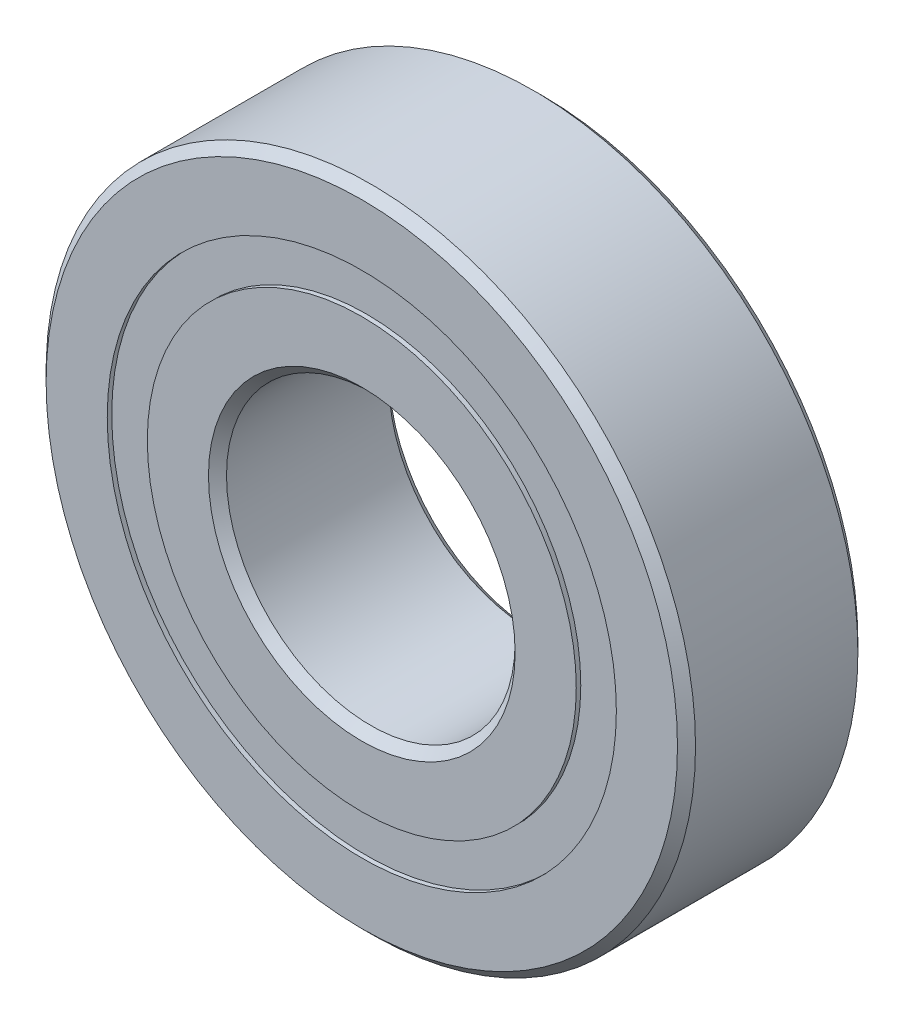
ISO-10303-21;
HEADER;
FILE_DESCRIPTION(('STEP AP214'),'2;1');
FILE_NAME('part.step','',(''),(''),'','','');
FILE_SCHEMA(('AUTOMOTIVE_DESIGN { 1 0 10303 214 1 1 1 1 }'));
ENDSEC;
DATA;
#1=APPLICATION_CONTEXT('core data for automotive mechanical design processes');
#2=APPLICATION_PROTOCOL_DEFINITION('international standard','automotive_design',2000,#1);
#3=PRODUCT_CONTEXT('',#1,'mechanical');
#4=PRODUCT('Part','Part','',(#3));
#5=PRODUCT_RELATED_PRODUCT_CATEGORY('part','',(#4));
#6=PRODUCT_DEFINITION_FORMATION('','',#4);
#7=PRODUCT_DEFINITION_CONTEXT('part definition',#1,'design');
#8=PRODUCT_DEFINITION('design','',#6,#7);
#9=PRODUCT_DEFINITION_SHAPE('','',#8);
#10=(LENGTH_UNIT() NAMED_UNIT(*) SI_UNIT(.MILLI.,.METRE.));
#11=(NAMED_UNIT(*) PLANE_ANGLE_UNIT() SI_UNIT($,.RADIAN.));
#12=(NAMED_UNIT(*) SI_UNIT($,.STERADIAN.) SOLID_ANGLE_UNIT());
#13=UNCERTAINTY_MEASURE_WITH_UNIT(LENGTH_MEASURE(1.E-05),#10,'distance_accuracy_value','');
#14=(GEOMETRIC_REPRESENTATION_CONTEXT(3) GLOBAL_UNCERTAINTY_ASSIGNED_CONTEXT((#13)) GLOBAL_UNIT_ASSIGNED_CONTEXT((#10,
#11,#12)) REPRESENTATION_CONTEXT('',''));
#15=CARTESIAN_POINT('',(0.,0.,0.));
#16=DIRECTION('',(0.,0.,1.));
#17=DIRECTION('',(1.,0.,0.));
#18=AXIS2_PLACEMENT_3D('',#15,#16,#17);
#19=CARTESIAN_POINT('',(0.,3.52777777777778,-0.621129993749945));
#20=DIRECTION('',(0.,0.,-1.));
#21=DIRECTION('',(-1.,0.,0.));
#22=AXIS2_PLACEMENT_3D('',#19,#20,#21);
#23=PLANE('',#22);
#24=CARTESIAN_POINT('',(0.,0.,-0.621129993749944));
#25=DIRECTION('',(0.,0.,1.));
#26=DIRECTION('',(1.,0.,0.));
#27=AXIS2_PLACEMENT_3D('',#24,#25,#26);
#28=CIRCLE('',#27,2.97222222222222);
#29=CARTESIAN_POINT('',(2.97222222222222,0.,-0.621129993749944));
#30=VERTEX_POINT('',#29);
#31=EDGE_CURVE('E11',#30,#30,#28,.T.);
#32=ORIENTED_EDGE('',*,*,#31,.F.);
#33=EDGE_LOOP('',(#32));
#34=FACE_BOUND('',#33,.T.);
#35=CARTESIAN_POINT('',(0.,0.,-0.621129993749946));
#36=DIRECTION('',(0.,0.,1.));
#37=DIRECTION('',(1.,0.,0.));
#38=AXIS2_PLACEMENT_3D('',#35,#36,#37);
#39=CIRCLE('',#38,3.52777777777778);
#40=CARTESIAN_POINT('',(3.52777777777778,0.,-0.621129993749946));
#41=VERTEX_POINT('',#40);
#42=EDGE_CURVE('E59',#41,#41,#39,.T.);
#43=ORIENTED_EDGE('',*,*,#42,.T.);
#44=EDGE_LOOP('',(#43));
#45=FACE_BOUND('',#44,.T.);
#46=ADVANCED_FACE('F45',(#34,#45),#23,.F.);
#47=CARTESIAN_POINT('',(0.,0.,1.25));
#48=DIRECTION('',(0.,0.,1.));
#49=DIRECTION('',(1.,0.,0.));
#50=AXIS2_PLACEMENT_3D('',#47,#48,#49);
#51=CYLINDRICAL_SURFACE('',#50,2.97222222222222);
#52=CARTESIAN_POINT('',(0.,0.,-1.1875));
#53=DIRECTION('',(0.,0.,1.));
#54=DIRECTION('',(1.,0.,0.));
#55=AXIS2_PLACEMENT_3D('',#52,#53,#54);
#56=CIRCLE('',#55,2.97222222222222);
#57=CARTESIAN_POINT('',(2.97222222222222,0.,-1.1875));
#58=VERTEX_POINT('',#57);
#59=EDGE_CURVE('E51',#58,#58,#56,.T.);
#60=ORIENTED_EDGE('',*,*,#59,.F.);
#61=EDGE_LOOP('',(#60));
#62=FACE_BOUND('',#61,.T.);
#63=ORIENTED_EDGE('',*,*,#31,.T.);
#64=EDGE_LOOP('',(#63));
#65=FACE_BOUND('',#64,.T.);
#66=ADVANCED_FACE('F74',(#62,#65),#51,.F.);
#67=CARTESIAN_POINT('',(0.,3.52777777777778,-1.1875));
#68=DIRECTION('',(0.,0.,1.));
#69=DIRECTION('',(1.,0.,0.));
#70=AXIS2_PLACEMENT_3D('',#67,#68,#69);
#71=PLANE('',#70);
#72=CARTESIAN_POINT('',(0.,0.,-1.1875));
#73=DIRECTION('',(0.,0.,1.));
#74=DIRECTION('',(1.,0.,0.));
#75=AXIS2_PLACEMENT_3D('',#72,#73,#74);
#76=CIRCLE('',#75,3.52777777777778);
#77=CARTESIAN_POINT('',(3.52777777777778,0.,-1.1875));
#78=VERTEX_POINT('',#77);
#79=EDGE_CURVE('E55',#78,#78,#76,.T.);
#80=ORIENTED_EDGE('',*,*,#79,.F.);
#81=EDGE_LOOP('',(#80));
#82=FACE_BOUND('',#81,.T.);
#83=ORIENTED_EDGE('',*,*,#59,.T.);
#84=EDGE_LOOP('',(#83));
#85=FACE_BOUND('',#84,.T.);
#86=ADVANCED_FACE('F69',(#82,#85),#71,.F.);
#87=CARTESIAN_POINT('',(0.,0.,1.25));
#88=DIRECTION('',(0.,0.,1.));
#89=DIRECTION('',(1.,0.,0.));
#90=AXIS2_PLACEMENT_3D('',#87,#88,#89);
#91=CYLINDRICAL_SURFACE('',#90,3.52777777777778);
#92=ORIENTED_EDGE('',*,*,#42,.F.);
#93=EDGE_LOOP('',(#92));
#94=FACE_BOUND('',#93,.T.);
#95=ORIENTED_EDGE('',*,*,#79,.T.);
#96=EDGE_LOOP('',(#95));
#97=FACE_BOUND('',#96,.T.);
#98=ADVANCED_FACE('F66',(#94,#97),#91,.T.);
#99=CLOSED_SHELL('',(#46,#66,#86,#98));
#100=MANIFOLD_SOLID_BREP('B2',#99);
#101=CARTESIAN_POINT('',(0.,3.52777777777778,1.18749999999999));
#102=DIRECTION('',(0.,0.,-1.));
#103=DIRECTION('',(-1.,0.,0.));
#104=AXIS2_PLACEMENT_3D('',#101,#102,#103);
#105=PLANE('',#104);
#106=CARTESIAN_POINT('',(0.,0.,1.18749999999999));
#107=DIRECTION('',(0.,0.,1.));
#108=DIRECTION('',(1.,0.,0.));
#109=AXIS2_PLACEMENT_3D('',#106,#107,#108);
#110=CIRCLE('',#109,2.97222222222222);
#111=CARTESIAN_POINT('',(2.97222222222222,0.,1.18749999999999));
#112=VERTEX_POINT('',#111);
#113=EDGE_CURVE('E44',#112,#112,#110,.T.);
#114=ORIENTED_EDGE('',*,*,#113,.F.);
#115=EDGE_LOOP('',(#114));
#116=FACE_BOUND('',#115,.T.);
#117=CARTESIAN_POINT('',(0.,0.,1.18749999999999));
#118=DIRECTION('',(0.,0.,1.));
#119=DIRECTION('',(1.,0.,0.));
#120=AXIS2_PLACEMENT_3D('',#117,#118,#119);
#121=CIRCLE('',#120,3.52777777777778);
#122=CARTESIAN_POINT('',(3.52777777777778,0.,1.18749999999999));
#123=VERTEX_POINT('',#122);
#124=EDGE_CURVE('E126',#123,#123,#121,.T.);
#125=ORIENTED_EDGE('',*,*,#124,.T.);
#126=EDGE_LOOP('',(#125));
#127=FACE_BOUND('',#126,.T.);
#128=ADVANCED_FACE('F112',(#116,#127),#105,.F.);
#129=CARTESIAN_POINT('',(0.,0.,1.25));
#130=DIRECTION('',(0.,0.,1.));
#131=DIRECTION('',(1.,0.,0.));
#132=AXIS2_PLACEMENT_3D('',#129,#130,#131);
#133=CYLINDRICAL_SURFACE('',#132,2.97222222222222);
#134=CARTESIAN_POINT('',(0.,0.,0.621129993749936));
#135=DIRECTION('',(0.,0.,1.));
#136=DIRECTION('',(1.,0.,0.));
#137=AXIS2_PLACEMENT_3D('',#134,#135,#136);
#138=CIRCLE('',#137,2.97222222222222);
#139=CARTESIAN_POINT('',(2.97222222222222,0.,0.621129993749936));
#140=VERTEX_POINT('',#139);
#141=EDGE_CURVE('E118',#140,#140,#138,.T.);
#142=ORIENTED_EDGE('',*,*,#141,.F.);
#143=EDGE_LOOP('',(#142));
#144=FACE_BOUND('',#143,.T.);
#145=ORIENTED_EDGE('',*,*,#113,.T.);
#146=EDGE_LOOP('',(#145));
#147=FACE_BOUND('',#146,.T.);
#148=ADVANCED_FACE('F141',(#144,#147),#133,.F.);
#149=CARTESIAN_POINT('',(0.,3.52777777777778,0.621129993749936));
#150=DIRECTION('',(0.,0.,1.));
#151=DIRECTION('',(1.,0.,0.));
#152=AXIS2_PLACEMENT_3D('',#149,#150,#151);
#153=PLANE('',#152);
#154=CARTESIAN_POINT('',(0.,0.,0.621129993749936));
#155=DIRECTION('',(0.,0.,1.));
#156=DIRECTION('',(1.,0.,0.));
#157=AXIS2_PLACEMENT_3D('',#154,#155,#156);
#158=CIRCLE('',#157,3.52777777777778);
#159=CARTESIAN_POINT('',(3.52777777777778,0.,0.621129993749936));
#160=VERTEX_POINT('',#159);
#161=EDGE_CURVE('E122',#160,#160,#158,.T.);
#162=ORIENTED_EDGE('',*,*,#161,.F.);
#163=EDGE_LOOP('',(#162));
#164=FACE_BOUND('',#163,.T.);
#165=ORIENTED_EDGE('',*,*,#141,.T.);
#166=EDGE_LOOP('',(#165));
#167=FACE_BOUND('',#166,.T.);
#168=ADVANCED_FACE('F136',(#164,#167),#153,.F.);
#169=CARTESIAN_POINT('',(0.,0.,1.25));
#170=DIRECTION('',(0.,0.,1.));
#171=DIRECTION('',(1.,0.,0.));
#172=AXIS2_PLACEMENT_3D('',#169,#170,#171);
#173=CYLINDRICAL_SURFACE('',#172,3.52777777777778);
#174=ORIENTED_EDGE('',*,*,#124,.F.);
#175=EDGE_LOOP('',(#174));
#176=FACE_BOUND('',#175,.T.);
#177=ORIENTED_EDGE('',*,*,#161,.T.);
#178=EDGE_LOOP('',(#177));
#179=FACE_BOUND('',#178,.T.);
#180=ADVANCED_FACE('F133',(#176,#179),#173,.T.);
#181=CLOSED_SHELL('',(#128,#148,#168,#180));
#182=MANIFOLD_SOLID_BREP('B6',#181);
#183=CARTESIAN_POINT('',(-1.32189408999631,2.96902273733847,0.));
#184=DIRECTION('',(0.,0.,1.));
#185=DIRECTION('',(-0.406736643075789,0.913545457642606,0.));
#186=AXIS2_PLACEMENT_3D('',#183,#184,#185);
#187=SPHERICAL_SURFACE('',#186,0.621129993749937);
#188=CARTESIAN_POINT('',(-1.32189408999631,2.96902273733847,0.621129993749933));
#189=VERTEX_POINT('',#188);
#190=VERTEX_LOOP('',#189);
#191=FACE_BOUND('',#190,.T.);
#192=ADVANCED_FACE('F179',(#191),#187,.T.);
#193=CLOSED_SHELL('',(#192));
#194=MANIFOLD_SOLID_BREP('B39',#193);
#195=CARTESIAN_POINT('',(-2.41522068280151,2.17467447066632,0.));
#196=DIRECTION('',(0.,0.,1.));
#197=DIRECTION('',(-0.743144825477386,0.669130606358867,0.));
#198=AXIS2_PLACEMENT_3D('',#195,#196,#197);
#199=SPHERICAL_SURFACE('',#198,0.621129993749937);
#200=CARTESIAN_POINT('',(-2.41522068280151,2.17467447066632,0.621129993749933));
#201=VERTEX_POINT('',#200);
#202=VERTEX_LOOP('',#201);
#203=FACE_BOUND('',#202,.T.);
#204=ADVANCED_FACE('F213',(#203),#199,.T.);
#205=CLOSED_SHELL('',(#204));
#206=MANIFOLD_SOLID_BREP('B108',#205);
#207=CARTESIAN_POINT('',(-3.09093367795924,1.00430523171861,0.));
#208=DIRECTION('',(0.,0.,1.));
#209=DIRECTION('',(-0.95105651629515,0.309016994374957,0.));
#210=AXIS2_PLACEMENT_3D('',#207,#208,#209);
#211=SPHERICAL_SURFACE('',#210,0.621129993749937);
#212=CARTESIAN_POINT('',(-3.09093367795924,1.00430523171861,0.621129993749933));
#213=VERTEX_POINT('',#212);
#214=VERTEX_LOOP('',#213);
#215=FACE_BOUND('',#214,.T.);
#216=ADVANCED_FACE('F247',(#215),#211,.T.);
#217=CLOSED_SHELL('',(#216));
#218=MANIFOLD_SOLID_BREP('B175',#217);
#219=CARTESIAN_POINT('',(-3.23219615994689,-0.339717505619842,0.));
#220=DIRECTION('',(0.,0.,1.));
#221=DIRECTION('',(-0.994521895368274,-0.104528463267644,0.));
#222=AXIS2_PLACEMENT_3D('',#219,#220,#221);
#223=SPHERICAL_SURFACE('',#222,0.621129993749937);
#224=CARTESIAN_POINT('',(-3.23219615994689,-0.339717505619842,0.621129993749933));
#225=VERTEX_POINT('',#224);
#226=VERTEX_LOOP('',#225);
#227=FACE_BOUND('',#226,.T.);
#228=ADVANCED_FACE('F281',(#227),#223,.T.);
#229=CLOSED_SHELL('',(#228));
#230=MANIFOLD_SOLID_BREP('B209',#229);
#231=CARTESIAN_POINT('',(-2.81458256229944,-1.62499999999997,0.));
#232=DIRECTION('',(0.,0.,1.));
#233=DIRECTION('',(-0.866025403784443,-0.499999999999992,0.));
#234=AXIS2_PLACEMENT_3D('',#231,#232,#233);
#235=SPHERICAL_SURFACE('',#234,0.621129993749937);
#236=CARTESIAN_POINT('',(-2.81458256229944,-1.62499999999997,0.621129993749933));
#237=VERTEX_POINT('',#236);
#238=VERTEX_LOOP('',#237);
#239=FACE_BOUND('',#238,.T.);
#240=ADVANCED_FACE('F315',(#239),#235,.T.);
#241=CLOSED_SHELL('',(#240));
#242=MANIFOLD_SOLID_BREP('B243',#241);
#243=CARTESIAN_POINT('',(-1.91030206995056,-2.62930523171856,0.));
#244=DIRECTION('',(0.,0.,1.));
#245=DIRECTION('',(-0.58778525229248,-0.809016994374943,0.));
#246=AXIS2_PLACEMENT_3D('',#243,#244,#245);
#247=SPHERICAL_SURFACE('',#246,0.621129993749937);
#248=CARTESIAN_POINT('',(-1.91030206995056,-2.62930523171856,0.621129993749933));
#249=VERTEX_POINT('',#248);
#250=VERTEX_LOOP('',#249);
#251=FACE_BOUND('',#250,.T.);
#252=ADVANCED_FACE('F349',(#251),#247,.T.);
#253=CLOSED_SHELL('',(#252));
#254=MANIFOLD_SOLID_BREP('B277',#253);
#255=CARTESIAN_POINT('',(-0.675712995157741,-3.17897970238486,0.));
#256=DIRECTION('',(0.,0.,1.));
#257=DIRECTION('',(-0.207911690817766,-0.978147600733804,0.));
#258=AXIS2_PLACEMENT_3D('',#255,#256,#257);
#259=SPHERICAL_SURFACE('',#258,0.621129993749937);
#260=CARTESIAN_POINT('',(-0.675712995157741,-3.17897970238486,0.621129993749933));
#261=VERTEX_POINT('',#260);
#262=VERTEX_LOOP('',#261);
#263=FACE_BOUND('',#262,.T.);
#264=ADVANCED_FACE('F383',(#263),#259,.T.);
#265=CLOSED_SHELL('',(#264));
#266=MANIFOLD_SOLID_BREP('B311',#265);
#267=CARTESIAN_POINT('',(0.675712995157698,-3.17897970238487,0.));
#268=DIRECTION('',(0.,0.,1.));
#269=DIRECTION('',(0.207911690817753,-0.978147600733807,0.));
#270=AXIS2_PLACEMENT_3D('',#267,#268,#269);
#271=SPHERICAL_SURFACE('',#270,0.621129993749937);
#272=CARTESIAN_POINT('',(0.675712995157698,-3.17897970238487,0.621129993749933));
#273=VERTEX_POINT('',#272);
#274=VERTEX_LOOP('',#273);
#275=FACE_BOUND('',#274,.T.);
#276=ADVANCED_FACE('F417',(#275),#271,.T.);
#277=CLOSED_SHELL('',(#276));
#278=MANIFOLD_SOLID_BREP('B345',#277);
#279=CARTESIAN_POINT('',(1.91030206995052,-2.62930523171859,0.));
#280=DIRECTION('',(0.,0.,1.));
#281=DIRECTION('',(0.587785252292469,-0.80901699437495,0.));
#282=AXIS2_PLACEMENT_3D('',#279,#280,#281);
#283=SPHERICAL_SURFACE('',#282,0.621129993749937);
#284=CARTESIAN_POINT('',(1.91030206995052,-2.62930523171859,0.621129993749933));
#285=VERTEX_POINT('',#284);
#286=VERTEX_LOOP('',#285);
#287=FACE_BOUND('',#286,.T.);
#288=ADVANCED_FACE('F451',(#287),#283,.T.);
#289=CLOSED_SHELL('',(#288));
#290=MANIFOLD_SOLID_BREP('B379',#289);
#291=CARTESIAN_POINT('',(2.81458256229942,-1.62500000000001,0.));
#292=DIRECTION('',(0.,0.,1.));
#293=DIRECTION('',(0.866025403784436,-0.500000000000004,0.));
#294=AXIS2_PLACEMENT_3D('',#291,#292,#293);
#295=SPHERICAL_SURFACE('',#294,0.621129993749937);
#296=CARTESIAN_POINT('',(2.81458256229942,-1.62500000000001,0.621129993749933));
#297=VERTEX_POINT('',#296);
#298=VERTEX_LOOP('',#297);
#299=FACE_BOUND('',#298,.T.);
#300=ADVANCED_FACE('F485',(#299),#295,.T.);
#301=CLOSED_SHELL('',(#300));
#302=MANIFOLD_SOLID_BREP('B413',#301);
#303=CARTESIAN_POINT('',(3.23219615994689,-0.339717505619886,0.));
#304=DIRECTION('',(0.,0.,1.));
#305=DIRECTION('',(0.994521895368273,-0.104528463267657,0.));
#306=AXIS2_PLACEMENT_3D('',#303,#304,#305);
#307=SPHERICAL_SURFACE('',#306,0.621129993749937);
#308=CARTESIAN_POINT('',(3.23219615994689,-0.339717505619886,0.621129993749933));
#309=VERTEX_POINT('',#308);
#310=VERTEX_LOOP('',#309);
#311=FACE_BOUND('',#310,.T.);
#312=ADVANCED_FACE('F519',(#311),#307,.T.);
#313=CLOSED_SHELL('',(#312));
#314=MANIFOLD_SOLID_BREP('B447',#313);
#315=CARTESIAN_POINT('',(3.09093367795925,1.00430523171857,0.));
#316=DIRECTION('',(0.,0.,1.));
#317=DIRECTION('',(0.951056516295154,0.309016994374945,0.));
#318=AXIS2_PLACEMENT_3D('',#315,#316,#317);
#319=SPHERICAL_SURFACE('',#318,0.621129993749937);
#320=CARTESIAN_POINT('',(3.09093367795925,1.00430523171857,0.621129993749933));
#321=VERTEX_POINT('',#320);
#322=VERTEX_LOOP('',#321);
#323=FACE_BOUND('',#322,.T.);
#324=ADVANCED_FACE('F553',(#323),#319,.T.);
#325=CLOSED_SHELL('',(#324));
#326=MANIFOLD_SOLID_BREP('B481',#325);
#327=CARTESIAN_POINT('',(2.41522068280154,2.17467447066628,0.));
#328=DIRECTION('',(0.,0.,1.));
#329=DIRECTION('',(0.743144825477395,0.669130606358857,0.));
#330=AXIS2_PLACEMENT_3D('',#327,#328,#329);
#331=SPHERICAL_SURFACE('',#330,0.621129993749937);
#332=CARTESIAN_POINT('',(2.41522068280154,2.17467447066628,0.621129993749933));
#333=VERTEX_POINT('',#332);
#334=VERTEX_LOOP('',#333);
#335=FACE_BOUND('',#334,.T.);
#336=ADVANCED_FACE('F587',(#335),#331,.T.);
#337=CLOSED_SHELL('',(#336));
#338=MANIFOLD_SOLID_BREP('B515',#337);
#339=CARTESIAN_POINT('',(1.32189408999635,2.96902273733845,0.));
#340=DIRECTION('',(0.,0.,1.));
#341=DIRECTION('',(0.406736643075801,0.913545457642601,0.));
#342=AXIS2_PLACEMENT_3D('',#339,#340,#341);
#343=SPHERICAL_SURFACE('',#342,0.621129993749937);
#344=CARTESIAN_POINT('',(1.32189408999635,2.96902273733845,0.621129993749933));
#345=VERTEX_POINT('',#344);
#346=VERTEX_LOOP('',#345);
#347=FACE_BOUND('',#346,.T.);
#348=ADVANCED_FACE('F621',(#347),#343,.T.);
#349=CLOSED_SHELL('',(#348));
#350=MANIFOLD_SOLID_BREP('B549',#349);
#351=CARTESIAN_POINT('',(0.,3.25,0.));
#352=DIRECTION('',(0.,0.,1.));
#353=DIRECTION('',(0.,1.,0.));
#354=AXIS2_PLACEMENT_3D('',#351,#352,#353);
#355=SPHERICAL_SURFACE('',#354,0.621129993749937);
#356=CARTESIAN_POINT('',(0.,3.25,0.621129993749933));
#357=VERTEX_POINT('',#356);
#358=VERTEX_LOOP('',#357);
#359=FACE_BOUND('',#358,.T.);
#360=ADVANCED_FACE('F657',(#359),#355,.T.);
#361=CLOSED_SHELL('',(#360));
#362=MANIFOLD_SOLID_BREP('B583',#361);
#363=CARTESIAN_POINT('',(0.,2.97222222222222,1.25));
#364=DIRECTION('',(0.,0.,-1.));
#365=DIRECTION('',(-1.,0.,0.));
#366=AXIS2_PLACEMENT_3D('',#363,#364,#365);
#367=PLANE('',#366);
#368=CARTESIAN_POINT('',(0.,0.,1.25));
#369=DIRECTION('',(0.,0.,1.));
#370=DIRECTION('',(1.,0.,0.));
#371=AXIS2_PLACEMENT_3D('',#368,#369,#370);
#372=CIRCLE('',#371,2.125);
#373=CARTESIAN_POINT('',(2.125,0.,1.25));
#374=VERTEX_POINT('',#373);
#375=EDGE_CURVE('E656',#374,#374,#372,.T.);
#376=ORIENTED_EDGE('',*,*,#375,.F.);
#377=EDGE_LOOP('',(#376));
#378=FACE_BOUND('',#377,.T.);
#379=CARTESIAN_POINT('',(0.,0.,1.25));
#380=DIRECTION('',(0.,0.,1.));
#381=DIRECTION('',(1.,0.,0.));
#382=AXIS2_PLACEMENT_3D('',#379,#380,#381);
#383=CIRCLE('',#382,2.97222222222222);
#384=CARTESIAN_POINT('',(2.97222222222222,0.,1.25));
#385=VERTEX_POINT('',#384);
#386=EDGE_CURVE('E704',#385,#385,#383,.T.);
#387=ORIENTED_EDGE('',*,*,#386,.T.);
#388=EDGE_LOOP('',(#387));
#389=FACE_BOUND('',#388,.T.);
#390=ADVANCED_FACE('F676',(#378,#389),#367,.F.);
#391=CARTESIAN_POINT('',(0.,0.,1.25));
#392=DIRECTION('',(0.,0.,1.));
#393=DIRECTION('',(1.,0.,0.));
#394=AXIS2_PLACEMENT_3D('',#391,#392,#393);
#395=CONICAL_SURFACE('',#394,2.125,0.785398163397428);
#396=CARTESIAN_POINT('',(0.,0.,1.125));
#397=DIRECTION('',(0.,0.,1.));
#398=DIRECTION('',(1.,0.,0.));
#399=AXIS2_PLACEMENT_3D('',#396,#397,#398);
#400=CIRCLE('',#399,2.);
#401=CARTESIAN_POINT('',(2.,0.,1.125));
#402=VERTEX_POINT('',#401);
#403=EDGE_CURVE('E682',#402,#402,#400,.T.);
#404=ORIENTED_EDGE('',*,*,#403,.F.);
#405=EDGE_LOOP('',(#404));
#406=FACE_BOUND('',#405,.T.);
#407=ORIENTED_EDGE('',*,*,#375,.T.);
#408=EDGE_LOOP('',(#407));
#409=FACE_BOUND('',#408,.T.);
#410=ADVANCED_FACE('F741',(#406,#409),#395,.F.);
#411=CARTESIAN_POINT('',(0.,0.,1.25));
#412=DIRECTION('',(0.,0.,1.));
#413=DIRECTION('',(1.,0.,0.));
#414=AXIS2_PLACEMENT_3D('',#411,#412,#413);
#415=CYLINDRICAL_SURFACE('',#414,2.);
#416=CARTESIAN_POINT('',(0.,0.,-1.125));
#417=DIRECTION('',(0.,0.,1.));
#418=DIRECTION('',(1.,0.,0.));
#419=AXIS2_PLACEMENT_3D('',#416,#417,#418);
#420=CIRCLE('',#419,2.);
#421=CARTESIAN_POINT('',(2.,0.,-1.125));
#422=VERTEX_POINT('',#421);
#423=EDGE_CURVE('E686',#422,#422,#420,.T.);
#424=ORIENTED_EDGE('',*,*,#423,.F.);
#425=EDGE_LOOP('',(#424));
#426=FACE_BOUND('',#425,.T.);
#427=ORIENTED_EDGE('',*,*,#403,.T.);
#428=EDGE_LOOP('',(#427));
#429=FACE_BOUND('',#428,.T.);
#430=ADVANCED_FACE('F736',(#426,#429),#415,.F.);
#431=CARTESIAN_POINT('',(0.,0.,-1.125));
#432=DIRECTION('',(0.,0.,-1.));
#433=DIRECTION('',(-1.,0.,0.));
#434=AXIS2_PLACEMENT_3D('',#431,#432,#433);
#435=CONICAL_SURFACE('',#434,2.,0.785398163397428);
#436=CARTESIAN_POINT('',(0.,0.,-1.25));
#437=DIRECTION('',(0.,0.,1.));
#438=DIRECTION('',(1.,0.,0.));
#439=AXIS2_PLACEMENT_3D('',#436,#437,#438);
#440=CIRCLE('',#439,2.125);
#441=CARTESIAN_POINT('',(2.125,0.,-1.25));
#442=VERTEX_POINT('',#441);
#443=EDGE_CURVE('E690',#442,#442,#440,.T.);
#444=ORIENTED_EDGE('',*,*,#443,.F.);
#445=EDGE_LOOP('',(#444));
#446=FACE_BOUND('',#445,.T.);
#447=ORIENTED_EDGE('',*,*,#423,.T.);
#448=EDGE_LOOP('',(#447));
#449=FACE_BOUND('',#448,.T.);
#450=ADVANCED_FACE('F730',(#446,#449),#435,.F.);
#451=CARTESIAN_POINT('',(0.,2.97222222222222,-1.25));
#452=DIRECTION('',(0.,0.,1.));
#453=DIRECTION('',(1.,0.,0.));
#454=AXIS2_PLACEMENT_3D('',#451,#452,#453);
#455=PLANE('',#454);
#456=CARTESIAN_POINT('',(0.,0.,-1.25));
#457=DIRECTION('',(0.,0.,1.));
#458=DIRECTION('',(1.,0.,0.));
#459=AXIS2_PLACEMENT_3D('',#456,#457,#458);
#460=CIRCLE('',#459,2.97222222222222);
#461=CARTESIAN_POINT('',(2.97222222222222,0.,-1.25));
#462=VERTEX_POINT('',#461);
#463=EDGE_CURVE('E695',#462,#462,#460,.T.);
#464=ORIENTED_EDGE('',*,*,#463,.F.);
#465=EDGE_LOOP('',(#464));
#466=FACE_BOUND('',#465,.T.);
#467=ORIENTED_EDGE('',*,*,#443,.T.);
#468=EDGE_LOOP('',(#467));
#469=FACE_BOUND('',#468,.T.);
#470=ADVANCED_FACE('F724',(#466,#469),#455,.F.);
#471=CARTESIAN_POINT('',(0.,0.,1.25));
#472=DIRECTION('',(0.,0.,1.));
#473=DIRECTION('',(1.,0.,0.));
#474=AXIS2_PLACEMENT_3D('',#471,#472,#473);
#475=CYLINDRICAL_SURFACE('',#474,2.97222222222222);
#476=CARTESIAN_POINT('',(0.,0.,-0.555555555555557));
#477=DIRECTION('',(0.,0.,1.));
#478=DIRECTION('',(1.,0.,0.));
#479=AXIS2_PLACEMENT_3D('',#476,#477,#478);
#480=CIRCLE('',#479,2.97222222222222);
#481=CARTESIAN_POINT('',(2.97222222222222,0.,-0.555555555555557));
#482=VERTEX_POINT('',#481);
#483=EDGE_CURVE('E698',#482,#482,#480,.T.);
#484=ORIENTED_EDGE('',*,*,#483,.F.);
#485=EDGE_LOOP('',(#484));
#486=FACE_BOUND('',#485,.T.);
#487=ORIENTED_EDGE('',*,*,#463,.T.);
#488=EDGE_LOOP('',(#487));
#489=FACE_BOUND('',#488,.T.);
#490=ADVANCED_FACE('F718',(#486,#489),#475,.T.);
#491=CARTESIAN_POINT('',(0.,0.,0.));
#492=DIRECTION('',(0.,0.,1.));
#493=DIRECTION('',(1.,0.,0.));
#494=AXIS2_PLACEMENT_3D('',#491,#492,#493);
#495=TOROIDAL_SURFACE('',#494,3.25,0.621129993749939);
#496=CARTESIAN_POINT('',(0.,0.,0.555555555555552));
#497=DIRECTION('',(0.,0.,1.));
#498=DIRECTION('',(1.,0.,0.));
#499=AXIS2_PLACEMENT_3D('',#496,#497,#498);
#500=CIRCLE('',#499,2.97222222222222);
#501=CARTESIAN_POINT('',(2.97222222222222,0.,0.555555555555552));
#502=VERTEX_POINT('',#501);
#503=EDGE_CURVE('E701',#502,#502,#500,.T.);
#504=ORIENTED_EDGE('',*,*,#503,.F.);
#505=EDGE_LOOP('',(#504));
#506=FACE_BOUND('',#505,.T.);
#507=ORIENTED_EDGE('',*,*,#483,.T.);
#508=EDGE_LOOP('',(#507));
#509=FACE_BOUND('',#508,.T.);
#510=ADVANCED_FACE('F712',(#506,#509),#495,.F.);
#511=CARTESIAN_POINT('',(0.,0.,1.25));
#512=DIRECTION('',(0.,0.,1.));
#513=DIRECTION('',(1.,0.,0.));
#514=AXIS2_PLACEMENT_3D('',#511,#512,#513);
#515=CYLINDRICAL_SURFACE('',#514,2.97222222222222);
#516=ORIENTED_EDGE('',*,*,#386,.F.);
#517=EDGE_LOOP('',(#516));
#518=FACE_BOUND('',#517,.T.);
#519=ORIENTED_EDGE('',*,*,#503,.T.);
#520=EDGE_LOOP('',(#519));
#521=FACE_BOUND('',#520,.T.);
#522=ADVANCED_FACE('F709',(#518,#521),#515,.T.);
#523=CLOSED_SHELL('',(#390,#410,#430,#450,#470,#490,#510,#522));
#524=MANIFOLD_SOLID_BREP('B617',#523);
#525=CARTESIAN_POINT('',(0.,0.,1.125));
#526=DIRECTION('',(0.,0.,-1.));
#527=DIRECTION('',(-1.,0.,0.));
#528=AXIS2_PLACEMENT_3D('',#525,#526,#527);
#529=CONICAL_SURFACE('',#528,4.5,0.785398163397448);
#530=CARTESIAN_POINT('',(0.,0.,1.25));
#531=DIRECTION('',(0.,0.,1.));
#532=DIRECTION('',(1.,0.,0.));
#533=AXIS2_PLACEMENT_3D('',#530,#531,#532);
#534=CIRCLE('',#533,4.375);
#535=CARTESIAN_POINT('',(4.375,0.,1.25));
#536=VERTEX_POINT('',#535);
#537=EDGE_CURVE('E825',#536,#536,#534,.T.);
#538=ORIENTED_EDGE('',*,*,#537,.F.);
#539=EDGE_LOOP('',(#538));
#540=FACE_BOUND('',#539,.T.);
#541=CARTESIAN_POINT('',(0.,0.,1.125));
#542=DIRECTION('',(0.,0.,1.));
#543=DIRECTION('',(1.,0.,0.));
#544=AXIS2_PLACEMENT_3D('',#541,#542,#543);
#545=CIRCLE('',#544,4.5);
#546=CARTESIAN_POINT('',(4.5,0.,1.125));
#547=VERTEX_POINT('',#546);
#548=EDGE_CURVE('E675',#547,#547,#545,.T.);
#549=ORIENTED_EDGE('',*,*,#548,.T.);
#550=EDGE_LOOP('',(#549));
#551=FACE_BOUND('',#550,.T.);
#552=ADVANCED_FACE('F797',(#540,#551),#529,.T.);
#553=CARTESIAN_POINT('',(0.,0.,1.25));
#554=DIRECTION('',(0.,0.,1.));
#555=DIRECTION('',(1.,0.,0.));
#556=AXIS2_PLACEMENT_3D('',#553,#554,#555);
#557=CYLINDRICAL_SURFACE('',#556,4.5);
#558=ORIENTED_EDGE('',*,*,#548,.F.);
#559=EDGE_LOOP('',(#558));
#560=FACE_BOUND('',#559,.T.);
#561=CARTESIAN_POINT('',(0.,0.,-1.12500000000001));
#562=DIRECTION('',(0.,0.,1.));
#563=DIRECTION('',(1.,0.,0.));
#564=AXIS2_PLACEMENT_3D('',#561,#562,#563);
#565=CIRCLE('',#564,4.5);
#566=CARTESIAN_POINT('',(4.5,0.,-1.12500000000001));
#567=VERTEX_POINT('',#566);
#568=EDGE_CURVE('E803',#567,#567,#565,.T.);
#569=ORIENTED_EDGE('',*,*,#568,.T.);
#570=EDGE_LOOP('',(#569));
#571=FACE_BOUND('',#570,.T.);
#572=ADVANCED_FACE('F832',(#560,#571),#557,.T.);
#573=CARTESIAN_POINT('',(0.,0.,-1.25000000000001));
#574=DIRECTION('',(0.,0.,1.));
#575=DIRECTION('',(1.,0.,0.));
#576=AXIS2_PLACEMENT_3D('',#573,#574,#575);
#577=CONICAL_SURFACE('',#576,4.375,0.785398163397448);
#578=ORIENTED_EDGE('',*,*,#568,.F.);
#579=EDGE_LOOP('',(#578));
#580=FACE_BOUND('',#579,.T.);
#581=CARTESIAN_POINT('',(0.,0.,-1.25000000000001));
#582=DIRECTION('',(0.,0.,1.));
#583=DIRECTION('',(1.,0.,0.));
#584=AXIS2_PLACEMENT_3D('',#581,#582,#583);
#585=CIRCLE('',#584,4.375);
#586=CARTESIAN_POINT('',(4.375,0.,-1.25000000000001));
#587=VERTEX_POINT('',#586);
#588=EDGE_CURVE('E807',#587,#587,#585,.T.);
#589=ORIENTED_EDGE('',*,*,#588,.T.);
#590=EDGE_LOOP('',(#589));
#591=FACE_BOUND('',#590,.T.);
#592=ADVANCED_FACE('F836',(#580,#591),#577,.T.);
#593=CARTESIAN_POINT('',(0.,4.375,-1.25000000000001));
#594=DIRECTION('',(0.,0.,1.));
#595=DIRECTION('',(1.,0.,0.));
#596=AXIS2_PLACEMENT_3D('',#593,#594,#595);
#597=PLANE('',#596);
#598=ORIENTED_EDGE('',*,*,#588,.F.);
#599=EDGE_LOOP('',(#598));
#600=FACE_BOUND('',#599,.T.);
#601=CARTESIAN_POINT('',(0.,0.,-1.25000000000001));
#602=DIRECTION('',(0.,0.,1.));
#603=DIRECTION('',(1.,0.,0.));
#604=AXIS2_PLACEMENT_3D('',#601,#602,#603);
#605=CIRCLE('',#604,3.52777777777778);
#606=CARTESIAN_POINT('',(3.52777777777778,0.,-1.25000000000001));
#607=VERTEX_POINT('',#606);
#608=EDGE_CURVE('E811',#607,#607,#605,.T.);
#609=ORIENTED_EDGE('',*,*,#608,.T.);
#610=EDGE_LOOP('',(#609));
#611=FACE_BOUND('',#610,.T.);
#612=ADVANCED_FACE('F841',(#600,#611),#597,.F.);
#613=CARTESIAN_POINT('',(0.,0.,1.25));
#614=DIRECTION('',(0.,0.,1.));
#615=DIRECTION('',(1.,0.,0.));
#616=AXIS2_PLACEMENT_3D('',#613,#614,#615);
#617=CYLINDRICAL_SURFACE('',#616,3.52777777777778);
#618=ORIENTED_EDGE('',*,*,#608,.F.);
#619=EDGE_LOOP('',(#618));
#620=FACE_BOUND('',#619,.T.);
#621=CARTESIAN_POINT('',(0.,0.,-0.55555555555556));
#622=DIRECTION('',(0.,0.,1.));
#623=DIRECTION('',(1.,0.,0.));
#624=AXIS2_PLACEMENT_3D('',#621,#622,#623);
#625=CIRCLE('',#624,3.52777777777778);
#626=CARTESIAN_POINT('',(3.52777777777778,0.,-0.55555555555556));
#627=VERTEX_POINT('',#626);
#628=EDGE_CURVE('E816',#627,#627,#625,.T.);
#629=ORIENTED_EDGE('',*,*,#628,.T.);
#630=EDGE_LOOP('',(#629));
#631=FACE_BOUND('',#630,.T.);
#632=ADVANCED_FACE('F847',(#620,#631),#617,.F.);
#633=CARTESIAN_POINT('',(0.,0.,0.));
#634=DIRECTION('',(0.,0.,1.));
#635=DIRECTION('',(1.,0.,0.));
#636=AXIS2_PLACEMENT_3D('',#633,#634,#635);
#637=TOROIDAL_SURFACE('',#636,3.25,0.621129993749941);
#638=ORIENTED_EDGE('',*,*,#628,.F.);
#639=EDGE_LOOP('',(#638));
#640=FACE_BOUND('',#639,.T.);
#641=CARTESIAN_POINT('',(0.,0.,0.555555555555552));
#642=DIRECTION('',(0.,0.,1.));
#643=DIRECTION('',(1.,0.,0.));
#644=AXIS2_PLACEMENT_3D('',#641,#642,#643);
#645=CIRCLE('',#644,3.52777777777778);
#646=CARTESIAN_POINT('',(3.52777777777778,0.,0.555555555555552));
#647=VERTEX_POINT('',#646);
#648=EDGE_CURVE('E819',#647,#647,#645,.T.);
#649=ORIENTED_EDGE('',*,*,#648,.T.);
#650=EDGE_LOOP('',(#649));
#651=FACE_BOUND('',#650,.T.);
#652=ADVANCED_FACE('F851',(#640,#651),#637,.F.);
#653=CARTESIAN_POINT('',(0.,0.,1.25));
#654=DIRECTION('',(0.,0.,1.));
#655=DIRECTION('',(1.,0.,0.));
#656=AXIS2_PLACEMENT_3D('',#653,#654,#655);
#657=CYLINDRICAL_SURFACE('',#656,3.52777777777778);
#658=ORIENTED_EDGE('',*,*,#648,.F.);
#659=EDGE_LOOP('',(#658));
#660=FACE_BOUND('',#659,.T.);
#661=CARTESIAN_POINT('',(0.,0.,1.25));
#662=DIRECTION('',(0.,0.,1.));
#663=DIRECTION('',(1.,0.,0.));
#664=AXIS2_PLACEMENT_3D('',#661,#662,#663);
#665=CIRCLE('',#664,3.52777777777778);
#666=CARTESIAN_POINT('',(3.52777777777778,0.,1.25));
#667=VERTEX_POINT('',#666);
#668=EDGE_CURVE('E822',#667,#667,#665,.T.);
#669=ORIENTED_EDGE('',*,*,#668,.T.);
#670=EDGE_LOOP('',(#669));
#671=FACE_BOUND('',#670,.T.);
#672=ADVANCED_FACE('F855',(#660,#671),#657,.F.);
#673=CARTESIAN_POINT('',(0.,4.375,1.25));
#674=DIRECTION('',(0.,0.,-1.));
#675=DIRECTION('',(-1.,0.,0.));
#676=AXIS2_PLACEMENT_3D('',#673,#674,#675);
#677=PLANE('',#676);
#678=ORIENTED_EDGE('',*,*,#668,.F.);
#679=EDGE_LOOP('',(#678));
#680=FACE_BOUND('',#679,.T.);
#681=ORIENTED_EDGE('',*,*,#537,.T.);
#682=EDGE_LOOP('',(#681));
#683=FACE_BOUND('',#682,.T.);
#684=ADVANCED_FACE('F829',(#680,#683),#677,.F.);
#685=CLOSED_SHELL('',(#552,#572,#592,#612,#632,#652,#672,#684));
#686=MANIFOLD_SOLID_BREP('B651',#685);
#687=ADVANCED_BREP_SHAPE_REPRESENTATION('',(#18,#100,#182,#194,#206,#218,#230,#242,#254,#266,
#278,#290,#302,#314,#326,#338,#350,#362,#524,#686),#14);
#688=SHAPE_DEFINITION_REPRESENTATION(#9,#687);
ENDSEC;
END-ISO-10303-21;
